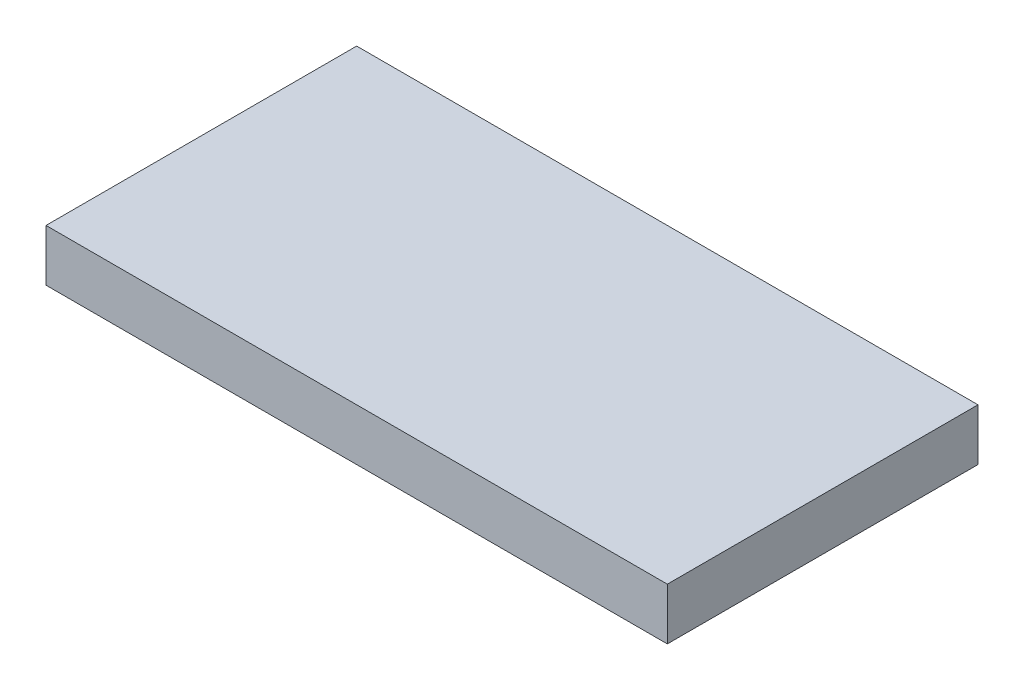
ISO-10303-21;
HEADER;
FILE_DESCRIPTION(('STEP AP214'),'2;1');
FILE_NAME('part.step','',(''),(''),'','','');
FILE_SCHEMA(('AUTOMOTIVE_DESIGN { 1 0 10303 214 1 1 1 1 }'));
ENDSEC;
DATA;
#1=APPLICATION_CONTEXT('core data for automotive mechanical design processes');
#2=APPLICATION_PROTOCOL_DEFINITION('international standard','automotive_design',2000,#1);
#3=PRODUCT_CONTEXT('',#1,'mechanical');
#4=PRODUCT('Part','Part','',(#3));
#5=PRODUCT_RELATED_PRODUCT_CATEGORY('part','',(#4));
#6=PRODUCT_DEFINITION_FORMATION('','',#4);
#7=PRODUCT_DEFINITION_CONTEXT('part definition',#1,'design');
#8=PRODUCT_DEFINITION('design','',#6,#7);
#9=PRODUCT_DEFINITION_SHAPE('','',#8);
#10=(LENGTH_UNIT() NAMED_UNIT(*) SI_UNIT(.MILLI.,.METRE.));
#11=(NAMED_UNIT(*) PLANE_ANGLE_UNIT() SI_UNIT($,.RADIAN.));
#12=(NAMED_UNIT(*) SI_UNIT($,.STERADIAN.) SOLID_ANGLE_UNIT());
#13=UNCERTAINTY_MEASURE_WITH_UNIT(LENGTH_MEASURE(1.E-05),#10,'distance_accuracy_value','');
#14=(GEOMETRIC_REPRESENTATION_CONTEXT(3) GLOBAL_UNCERTAINTY_ASSIGNED_CONTEXT((#13)) GLOBAL_UNIT_ASSIGNED_CONTEXT((#10,
#11,#12)) REPRESENTATION_CONTEXT('',''));
#15=CARTESIAN_POINT('',(0.,0.,0.));
#16=DIRECTION('',(0.,0.,1.));
#17=DIRECTION('',(1.,0.,0.));
#18=AXIS2_PLACEMENT_3D('',#15,#16,#17);
#19=CARTESIAN_POINT('',(-12.,2.,-6.));
#20=DIRECTION('',(1.,0.,0.));
#21=DIRECTION('',(0.,0.,-1.));
#22=AXIS2_PLACEMENT_3D('',#19,#20,#21);
#23=PLANE('',#22);
#24=DIRECTION('',(0.,0.,1.));
#25=VECTOR('',#24,1.);
#26=CARTESIAN_POINT('',(-12.,0.,-6.));
#27=LINE('',#26,#25);
#28=CARTESIAN_POINT('',(-12.,0.,-6.));
#29=VERTEX_POINT('',#28);
#30=CARTESIAN_POINT('',(-12.,0.,6.));
#31=VERTEX_POINT('',#30);
#32=EDGE_CURVE('E95',#29,#31,#27,.T.);
#33=ORIENTED_EDGE('',*,*,#32,.T.);
#34=DIRECTION('',(0.,-1.,0.));
#35=VECTOR('',#34,1.);
#36=CARTESIAN_POINT('',(-12.,2.,6.));
#37=LINE('',#36,#35);
#38=CARTESIAN_POINT('',(-12.,2.,6.));
#39=VERTEX_POINT('',#38);
#40=EDGE_CURVE('E11',#39,#31,#37,.T.);
#41=ORIENTED_EDGE('',*,*,#40,.F.);
#42=DIRECTION('',(0.,0.,1.));
#43=VECTOR('',#42,1.);
#44=CARTESIAN_POINT('',(-12.,2.,-6.));
#45=LINE('',#44,#43);
#46=CARTESIAN_POINT('',(-12.,2.,-6.));
#47=VERTEX_POINT('',#46);
#48=EDGE_CURVE('E83',#47,#39,#45,.T.);
#49=ORIENTED_EDGE('',*,*,#48,.F.);
#50=DIRECTION('',(0.,-1.,0.));
#51=VECTOR('',#50,1.);
#52=CARTESIAN_POINT('',(-12.,2.,-6.));
#53=LINE('',#52,#51);
#54=EDGE_CURVE('E91',#47,#29,#53,.T.);
#55=ORIENTED_EDGE('',*,*,#54,.T.);
#56=EDGE_LOOP('',(#33,#41,#49,#55));
#57=FACE_BOUND('',#56,.T.);
#58=ADVANCED_FACE('F32',(#57),#23,.F.);
#59=CARTESIAN_POINT('',(12.,2.,6.));
#60=DIRECTION('',(0.,0.,-1.));
#61=DIRECTION('',(-1.,0.,0.));
#62=AXIS2_PLACEMENT_3D('',#59,#60,#61);
#63=PLANE('',#62);
#64=DIRECTION('',(1.,0.,0.));
#65=VECTOR('',#64,1.);
#66=CARTESIAN_POINT('',(12.,0.,6.));
#67=LINE('',#66,#65);
#68=CARTESIAN_POINT('',(12.,0.,6.));
#69=VERTEX_POINT('',#68);
#70=EDGE_CURVE('E87',#31,#69,#67,.T.);
#71=ORIENTED_EDGE('',*,*,#70,.T.);
#72=DIRECTION('',(0.,-1.,0.));
#73=VECTOR('',#72,1.);
#74=CARTESIAN_POINT('',(12.,2.,6.));
#75=LINE('',#74,#73);
#76=CARTESIAN_POINT('',(12.,2.,6.));
#77=VERTEX_POINT('',#76);
#78=EDGE_CURVE('E40',#77,#69,#75,.T.);
#79=ORIENTED_EDGE('',*,*,#78,.F.);
#80=DIRECTION('',(1.,0.,0.));
#81=VECTOR('',#80,1.);
#82=CARTESIAN_POINT('',(12.,2.,6.));
#83=LINE('',#82,#81);
#84=EDGE_CURVE('E78',#39,#77,#83,.T.);
#85=ORIENTED_EDGE('',*,*,#84,.F.);
#86=ORIENTED_EDGE('',*,*,#40,.T.);
#87=EDGE_LOOP('',(#71,#79,#85,#86));
#88=FACE_BOUND('',#87,.T.);
#89=ADVANCED_FACE('F86',(#88),#63,.F.);
#90=CARTESIAN_POINT('',(12.,2.,-6.));
#91=DIRECTION('',(-1.,0.,0.));
#92=DIRECTION('',(0.,0.,1.));
#93=AXIS2_PLACEMENT_3D('',#90,#91,#92);
#94=PLANE('',#93);
#95=DIRECTION('',(0.,0.,-1.));
#96=VECTOR('',#95,1.);
#97=CARTESIAN_POINT('',(12.,0.,-6.));
#98=LINE('',#97,#96);
#99=CARTESIAN_POINT('',(12.,0.,-6.));
#100=VERTEX_POINT('',#99);
#101=EDGE_CURVE('E65',#69,#100,#98,.T.);
#102=ORIENTED_EDGE('',*,*,#101,.T.);
#103=DIRECTION('',(0.,-1.,0.));
#104=VECTOR('',#103,1.);
#105=CARTESIAN_POINT('',(12.,2.,-6.));
#106=LINE('',#105,#104);
#107=CARTESIAN_POINT('',(12.,2.,-6.));
#108=VERTEX_POINT('',#107);
#109=EDGE_CURVE('E88',#108,#100,#106,.T.);
#110=ORIENTED_EDGE('',*,*,#109,.F.);
#111=DIRECTION('',(0.,0.,-1.));
#112=VECTOR('',#111,1.);
#113=CARTESIAN_POINT('',(12.,2.,-6.));
#114=LINE('',#113,#112);
#115=EDGE_CURVE('E81',#77,#108,#114,.T.);
#116=ORIENTED_EDGE('',*,*,#115,.F.);
#117=ORIENTED_EDGE('',*,*,#78,.T.);
#118=EDGE_LOOP('',(#102,#110,#116,#117));
#119=FACE_BOUND('',#118,.T.);
#120=ADVANCED_FACE('F89',(#119),#94,.F.);
#121=CARTESIAN_POINT('',(12.,2.,-6.));
#122=DIRECTION('',(0.,0.,1.));
#123=DIRECTION('',(1.,0.,0.));
#124=AXIS2_PLACEMENT_3D('',#121,#122,#123);
#125=PLANE('',#124);
#126=DIRECTION('',(-1.,0.,0.));
#127=VECTOR('',#126,1.);
#128=CARTESIAN_POINT('',(12.,0.,-6.));
#129=LINE('',#128,#127);
#130=EDGE_CURVE('E71',#100,#29,#129,.T.);
#131=ORIENTED_EDGE('',*,*,#130,.T.);
#132=ORIENTED_EDGE('',*,*,#54,.F.);
#133=DIRECTION('',(-1.,0.,0.));
#134=VECTOR('',#133,1.);
#135=CARTESIAN_POINT('',(12.,2.,-6.));
#136=LINE('',#135,#134);
#137=EDGE_CURVE('E48',#108,#47,#136,.T.);
#138=ORIENTED_EDGE('',*,*,#137,.F.);
#139=ORIENTED_EDGE('',*,*,#109,.T.);
#140=EDGE_LOOP('',(#131,#132,#138,#139));
#141=FACE_BOUND('',#140,.T.);
#142=ADVANCED_FACE('F102',(#141),#125,.F.);
#143=CARTESIAN_POINT('',(0.,2.,0.));
#144=DIRECTION('',(0.,-1.,0.));
#145=DIRECTION('',(0.,0.,-1.));
#146=AXIS2_PLACEMENT_3D('',#143,#144,#145);
#147=PLANE('',#146);
#148=ORIENTED_EDGE('',*,*,#48,.T.);
#149=ORIENTED_EDGE('',*,*,#84,.T.);
#150=ORIENTED_EDGE('',*,*,#115,.T.);
#151=ORIENTED_EDGE('',*,*,#137,.T.);
#152=EDGE_LOOP('',(#148,#149,#150,#151));
#153=FACE_BOUND('',#152,.T.);
#154=ADVANCED_FACE('F79',(#153),#147,.F.);
#155=CARTESIAN_POINT('',(0.,0.,0.));
#156=DIRECTION('',(0.,-1.,0.));
#157=DIRECTION('',(0.,0.,-1.));
#158=AXIS2_PLACEMENT_3D('',#155,#156,#157);
#159=PLANE('',#158);
#160=ORIENTED_EDGE('',*,*,#32,.F.);
#161=ORIENTED_EDGE('',*,*,#130,.F.);
#162=ORIENTED_EDGE('',*,*,#101,.F.);
#163=ORIENTED_EDGE('',*,*,#70,.F.);
#164=EDGE_LOOP('',(#160,#161,#162,#163));
#165=FACE_BOUND('',#164,.T.);
#166=ADVANCED_FACE('F105',(#165),#159,.T.);
#167=CLOSED_SHELL('',(#58,#89,#120,#142,#154,#166));
#168=MANIFOLD_SOLID_BREP('B2',#167);
#169=ADVANCED_BREP_SHAPE_REPRESENTATION('',(#18,#168),#14);
#170=SHAPE_DEFINITION_REPRESENTATION(#9,#169);
ENDSEC;
END-ISO-10303-21;
